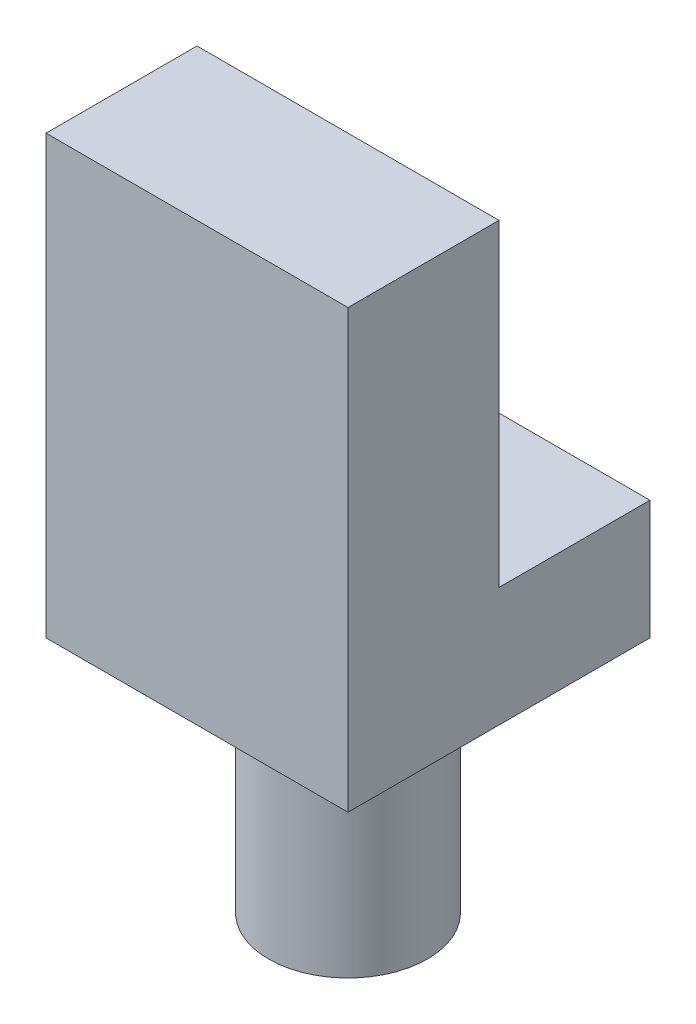
ISO-10303-21;
HEADER;
FILE_DESCRIPTION(('STEP AP214'),'2;1');
FILE_NAME('part.step','',(''),(''),'','','');
FILE_SCHEMA(('AUTOMOTIVE_DESIGN { 1 0 10303 214 1 1 1 1 }'));
ENDSEC;
DATA;
#1=APPLICATION_CONTEXT('core data for automotive mechanical design processes');
#2=APPLICATION_PROTOCOL_DEFINITION('international standard','automotive_design',2000,#1);
#3=PRODUCT_CONTEXT('',#1,'mechanical');
#4=PRODUCT('Part','Part','',(#3));
#5=PRODUCT_RELATED_PRODUCT_CATEGORY('part','',(#4));
#6=PRODUCT_DEFINITION_FORMATION('','',#4);
#7=PRODUCT_DEFINITION_CONTEXT('part definition',#1,'design');
#8=PRODUCT_DEFINITION('design','',#6,#7);
#9=PRODUCT_DEFINITION_SHAPE('','',#8);
#10=(LENGTH_UNIT() NAMED_UNIT(*) SI_UNIT(.MILLI.,.METRE.));
#11=(NAMED_UNIT(*) PLANE_ANGLE_UNIT() SI_UNIT($,.RADIAN.));
#12=(NAMED_UNIT(*) SI_UNIT($,.STERADIAN.) SOLID_ANGLE_UNIT());
#13=UNCERTAINTY_MEASURE_WITH_UNIT(LENGTH_MEASURE(1.E-05),#10,'distance_accuracy_value','');
#14=(GEOMETRIC_REPRESENTATION_CONTEXT(3) GLOBAL_UNCERTAINTY_ASSIGNED_CONTEXT((#13)) GLOBAL_UNIT_ASSIGNED_CONTEXT((#10,
#11,#12)) REPRESENTATION_CONTEXT('',''));
#15=CARTESIAN_POINT('',(0.,0.,0.));
#16=DIRECTION('',(0.,0.,1.));
#17=DIRECTION('',(1.,0.,0.));
#18=AXIS2_PLACEMENT_3D('',#15,#16,#17);
#19=CARTESIAN_POINT('',(0.,45.,0.));
#20=DIRECTION('',(0.,-1.,0.));
#21=DIRECTION('',(0.,0.,-1.));
#22=AXIS2_PLACEMENT_3D('',#19,#20,#21);
#23=PLANE('',#22);
#24=DIRECTION('',(-1.,0.,0.));
#25=VECTOR('',#24,1.);
#26=CARTESIAN_POINT('',(-19.,45.,0.));
#27=LINE('',#26,#25);
#28=CARTESIAN_POINT('',(19.,45.,0.));
#29=VERTEX_POINT('',#28);
#30=CARTESIAN_POINT('',(-19.,45.,0.));
#31=VERTEX_POINT('',#30);
#32=EDGE_CURVE('E61',#29,#31,#27,.T.);
#33=ORIENTED_EDGE('',*,*,#32,.F.);
#34=DIRECTION('',(0.,0.,-1.));
#35=VECTOR('',#34,1.);
#36=CARTESIAN_POINT('',(19.,45.,19.));
#37=LINE('',#36,#35);
#38=CARTESIAN_POINT('',(19.,45.,-19.));
#39=VERTEX_POINT('',#38);
#40=EDGE_CURVE('E99',#29,#39,#37,.T.);
#41=ORIENTED_EDGE('',*,*,#40,.T.);
#42=DIRECTION('',(-1.,0.,0.));
#43=VECTOR('',#42,1.);
#44=CARTESIAN_POINT('',(-19.,45.,-19.));
#45=LINE('',#44,#43);
#46=CARTESIAN_POINT('',(-19.,45.,-19.));
#47=VERTEX_POINT('',#46);
#48=EDGE_CURVE('E67',#39,#47,#45,.T.);
#49=ORIENTED_EDGE('',*,*,#48,.T.);
#50=DIRECTION('',(0.,0.,1.));
#51=VECTOR('',#50,1.);
#52=CARTESIAN_POINT('',(-19.,45.,19.));
#53=LINE('',#52,#51);
#54=EDGE_CURVE('E112',#47,#31,#53,.T.);
#55=ORIENTED_EDGE('',*,*,#54,.T.);
#56=EDGE_LOOP('',(#33,#41,#49,#55));
#57=FACE_BOUND('',#56,.T.);
#58=ADVANCED_FACE('F46',(#57),#23,.F.);
#59=CARTESIAN_POINT('',(0.,30.,0.));
#60=DIRECTION('',(0.,-1.,0.));
#61=DIRECTION('',(0.,0.,-1.));
#62=AXIS2_PLACEMENT_3D('',#59,#60,#61);
#63=CYLINDRICAL_SURFACE('',#62,10.);
#64=CARTESIAN_POINT('',(0.,30.,0.));
#65=DIRECTION('',(0.,1.,0.));
#66=DIRECTION('',(0.,0.,1.));
#67=AXIS2_PLACEMENT_3D('',#64,#65,#66);
#68=CIRCLE('',#67,10.);
#69=CARTESIAN_POINT('',(0.,30.,10.));
#70=VERTEX_POINT('',#69);
#71=EDGE_CURVE('E12',#70,#70,#68,.T.);
#72=ORIENTED_EDGE('',*,*,#71,.F.);
#73=EDGE_LOOP('',(#72));
#74=FACE_BOUND('',#73,.T.);
#75=CARTESIAN_POINT('',(0.,0.,0.));
#76=DIRECTION('',(0.,1.,0.));
#77=DIRECTION('',(0.,0.,1.));
#78=AXIS2_PLACEMENT_3D('',#75,#76,#77);
#79=CIRCLE('',#78,10.);
#80=CARTESIAN_POINT('',(0.,0.,10.));
#81=VERTEX_POINT('',#80);
#82=EDGE_CURVE('E50',#81,#81,#79,.T.);
#83=ORIENTED_EDGE('',*,*,#82,.T.);
#84=EDGE_LOOP('',(#83));
#85=FACE_BOUND('',#84,.T.);
#86=ADVANCED_FACE('F48',(#74,#85),#63,.T.);
#87=CARTESIAN_POINT('',(0.,0.,0.));
#88=DIRECTION('',(0.,1.,0.));
#89=DIRECTION('',(0.,0.,1.));
#90=AXIS2_PLACEMENT_3D('',#87,#88,#89);
#91=PLANE('',#90);
#92=ORIENTED_EDGE('',*,*,#82,.F.);
#93=EDGE_LOOP('',(#92));
#94=FACE_BOUND('',#93,.T.);
#95=ADVANCED_FACE('F144',(#94),#91,.F.);
#96=CARTESIAN_POINT('',(19.,45.,19.));
#97=DIRECTION('',(-1.,0.,0.));
#98=DIRECTION('',(0.,0.,1.));
#99=AXIS2_PLACEMENT_3D('',#96,#97,#98);
#100=PLANE('',#99);
#101=DIRECTION('',(0.,0.,-1.));
#102=VECTOR('',#101,1.);
#103=CARTESIAN_POINT('',(19.,30.,19.));
#104=LINE('',#103,#102);
#105=CARTESIAN_POINT('',(19.,30.,19.));
#106=VERTEX_POINT('',#105);
#107=CARTESIAN_POINT('',(19.,30.,-19.));
#108=VERTEX_POINT('',#107);
#109=EDGE_CURVE('E107',#106,#108,#104,.T.);
#110=ORIENTED_EDGE('',*,*,#109,.T.);
#111=DIRECTION('',(0.,-1.,0.));
#112=VECTOR('',#111,1.);
#113=CARTESIAN_POINT('',(19.,45.,-19.));
#114=LINE('',#113,#112);
#115=EDGE_CURVE('E135',#39,#108,#114,.T.);
#116=ORIENTED_EDGE('',*,*,#115,.F.);
#117=ORIENTED_EDGE('',*,*,#40,.F.);
#118=DIRECTION('',(0.,-1.,0.));
#119=VECTOR('',#118,1.);
#120=CARTESIAN_POINT('',(19.,85.,0.));
#121=LINE('',#120,#119);
#122=CARTESIAN_POINT('',(19.,85.,0.));
#123=VERTEX_POINT('',#122);
#124=EDGE_CURVE('E118',#123,#29,#121,.T.);
#125=ORIENTED_EDGE('',*,*,#124,.F.);
#126=DIRECTION('',(0.,0.,-1.));
#127=VECTOR('',#126,1.);
#128=CARTESIAN_POINT('',(19.,85.,19.));
#129=LINE('',#128,#127);
#130=CARTESIAN_POINT('',(19.,85.,19.));
#131=VERTEX_POINT('',#130);
#132=EDGE_CURVE('E110',#131,#123,#129,.T.);
#133=ORIENTED_EDGE('',*,*,#132,.F.);
#134=DIRECTION('',(0.,-1.,0.));
#135=VECTOR('',#134,1.);
#136=CARTESIAN_POINT('',(19.,45.,19.));
#137=LINE('',#136,#135);
#138=EDGE_CURVE('E92',#131,#106,#137,.T.);
#139=ORIENTED_EDGE('',*,*,#138,.T.);
#140=EDGE_LOOP('',(#110,#116,#117,#125,#133,#139));
#141=FACE_BOUND('',#140,.T.);
#142=ADVANCED_FACE('F105',(#141),#100,.F.);
#143=CARTESIAN_POINT('',(-19.,45.,-19.));
#144=DIRECTION('',(0.,0.,1.));
#145=DIRECTION('',(1.,0.,0.));
#146=AXIS2_PLACEMENT_3D('',#143,#144,#145);
#147=PLANE('',#146);
#148=DIRECTION('',(-1.,0.,0.));
#149=VECTOR('',#148,1.);
#150=CARTESIAN_POINT('',(-19.,30.,-19.));
#151=LINE('',#150,#149);
#152=CARTESIAN_POINT('',(-19.,30.,-19.));
#153=VERTEX_POINT('',#152);
#154=EDGE_CURVE('E115',#108,#153,#151,.T.);
#155=ORIENTED_EDGE('',*,*,#154,.T.);
#156=DIRECTION('',(0.,-1.,0.));
#157=VECTOR('',#156,1.);
#158=CARTESIAN_POINT('',(-19.,45.,-19.));
#159=LINE('',#158,#157);
#160=EDGE_CURVE('E132',#47,#153,#159,.T.);
#161=ORIENTED_EDGE('',*,*,#160,.F.);
#162=ORIENTED_EDGE('',*,*,#48,.F.);
#163=ORIENTED_EDGE('',*,*,#115,.T.);
#164=EDGE_LOOP('',(#155,#161,#162,#163));
#165=FACE_BOUND('',#164,.T.);
#166=ADVANCED_FACE('F150',(#165),#147,.F.);
#167=CARTESIAN_POINT('',(-19.,45.,19.));
#168=DIRECTION('',(1.,0.,0.));
#169=DIRECTION('',(0.,0.,-1.));
#170=AXIS2_PLACEMENT_3D('',#167,#168,#169);
#171=PLANE('',#170);
#172=DIRECTION('',(0.,0.,1.));
#173=VECTOR('',#172,1.);
#174=CARTESIAN_POINT('',(-19.,30.,19.));
#175=LINE('',#174,#173);
#176=CARTESIAN_POINT('',(-19.,30.,19.));
#177=VERTEX_POINT('',#176);
#178=EDGE_CURVE('E100',#153,#177,#175,.T.);
#179=ORIENTED_EDGE('',*,*,#178,.T.);
#180=DIRECTION('',(0.,-1.,0.));
#181=VECTOR('',#180,1.);
#182=CARTESIAN_POINT('',(-19.,45.,19.));
#183=LINE('',#182,#181);
#184=CARTESIAN_POINT('',(-19.,85.,19.));
#185=VERTEX_POINT('',#184);
#186=EDGE_CURVE('E95',#185,#177,#183,.T.);
#187=ORIENTED_EDGE('',*,*,#186,.F.);
#188=DIRECTION('',(0.,0.,1.));
#189=VECTOR('',#188,1.);
#190=CARTESIAN_POINT('',(-19.,85.,19.));
#191=LINE('',#190,#189);
#192=CARTESIAN_POINT('',(-19.,85.,0.));
#193=VERTEX_POINT('',#192);
#194=EDGE_CURVE('E187',#193,#185,#191,.T.);
#195=ORIENTED_EDGE('',*,*,#194,.F.);
#196=DIRECTION('',(0.,-1.,0.));
#197=VECTOR('',#196,1.);
#198=CARTESIAN_POINT('',(-19.,85.,0.));
#199=LINE('',#198,#197);
#200=EDGE_CURVE('E125',#193,#31,#199,.T.);
#201=ORIENTED_EDGE('',*,*,#200,.T.);
#202=ORIENTED_EDGE('',*,*,#54,.F.);
#203=ORIENTED_EDGE('',*,*,#160,.T.);
#204=EDGE_LOOP('',(#179,#187,#195,#201,#202,#203));
#205=FACE_BOUND('',#204,.T.);
#206=ADVANCED_FACE('F166',(#205),#171,.F.);
#207=CARTESIAN_POINT('',(-19.,45.,19.));
#208=DIRECTION('',(0.,0.,-1.));
#209=DIRECTION('',(-1.,0.,0.));
#210=AXIS2_PLACEMENT_3D('',#207,#208,#209);
#211=PLANE('',#210);
#212=DIRECTION('',(1.,0.,0.));
#213=VECTOR('',#212,1.);
#214=CARTESIAN_POINT('',(-19.,30.,19.));
#215=LINE('',#214,#213);
#216=EDGE_CURVE('E87',#177,#106,#215,.T.);
#217=ORIENTED_EDGE('',*,*,#216,.T.);
#218=ORIENTED_EDGE('',*,*,#138,.F.);
#219=DIRECTION('',(1.,0.,0.));
#220=VECTOR('',#219,1.);
#221=CARTESIAN_POINT('',(-19.,85.,19.));
#222=LINE('',#221,#220);
#223=EDGE_CURVE('E193',#185,#131,#222,.T.);
#224=ORIENTED_EDGE('',*,*,#223,.F.);
#225=ORIENTED_EDGE('',*,*,#186,.T.);
#226=EDGE_LOOP('',(#217,#218,#224,#225));
#227=FACE_BOUND('',#226,.T.);
#228=ADVANCED_FACE('F89',(#227),#211,.F.);
#229=CARTESIAN_POINT('',(0.,30.,0.));
#230=DIRECTION('',(0.,-1.,0.));
#231=DIRECTION('',(0.,0.,-1.));
#232=AXIS2_PLACEMENT_3D('',#229,#230,#231);
#233=PLANE('',#232);
#234=ORIENTED_EDGE('',*,*,#71,.T.);
#235=EDGE_LOOP('',(#234));
#236=FACE_BOUND('',#235,.T.);
#237=ORIENTED_EDGE('',*,*,#109,.F.);
#238=ORIENTED_EDGE('',*,*,#216,.F.);
#239=ORIENTED_EDGE('',*,*,#178,.F.);
#240=ORIENTED_EDGE('',*,*,#154,.F.);
#241=EDGE_LOOP('',(#237,#238,#239,#240));
#242=FACE_BOUND('',#241,.T.);
#243=ADVANCED_FACE('F114',(#236,#242),#233,.T.);
#244=CARTESIAN_POINT('',(-19.,85.,0.));
#245=DIRECTION('',(0.,0.,1.));
#246=DIRECTION('',(1.,0.,0.));
#247=AXIS2_PLACEMENT_3D('',#244,#245,#246);
#248=PLANE('',#247);
#249=ORIENTED_EDGE('',*,*,#32,.T.);
#250=ORIENTED_EDGE('',*,*,#200,.F.);
#251=DIRECTION('',(-1.,0.,0.));
#252=VECTOR('',#251,1.);
#253=CARTESIAN_POINT('',(-19.,85.,0.));
#254=LINE('',#253,#252);
#255=EDGE_CURVE('E185',#123,#193,#254,.T.);
#256=ORIENTED_EDGE('',*,*,#255,.F.);
#257=ORIENTED_EDGE('',*,*,#124,.T.);
#258=EDGE_LOOP('',(#249,#250,#256,#257));
#259=FACE_BOUND('',#258,.T.);
#260=ADVANCED_FACE('F159',(#259),#248,.F.);
#261=CARTESIAN_POINT('',(0.,85.,0.));
#262=DIRECTION('',(0.,-1.,0.));
#263=DIRECTION('',(0.,0.,-1.));
#264=AXIS2_PLACEMENT_3D('',#261,#262,#263);
#265=PLANE('',#264);
#266=ORIENTED_EDGE('',*,*,#194,.T.);
#267=ORIENTED_EDGE('',*,*,#223,.T.);
#268=ORIENTED_EDGE('',*,*,#132,.T.);
#269=ORIENTED_EDGE('',*,*,#255,.T.);
#270=EDGE_LOOP('',(#266,#267,#268,#269));
#271=FACE_BOUND('',#270,.T.);
#272=ADVANCED_FACE('F198',(#271),#265,.F.);
#273=CLOSED_SHELL('',(#58,#86,#95,#142,#166,#206,#228,#243,#260,#272));
#274=MANIFOLD_SOLID_BREP('B2',#273);
#275=ADVANCED_BREP_SHAPE_REPRESENTATION('',(#18,#274),#14);
#276=SHAPE_DEFINITION_REPRESENTATION(#9,#275);
ENDSEC;
END-ISO-10303-21;
